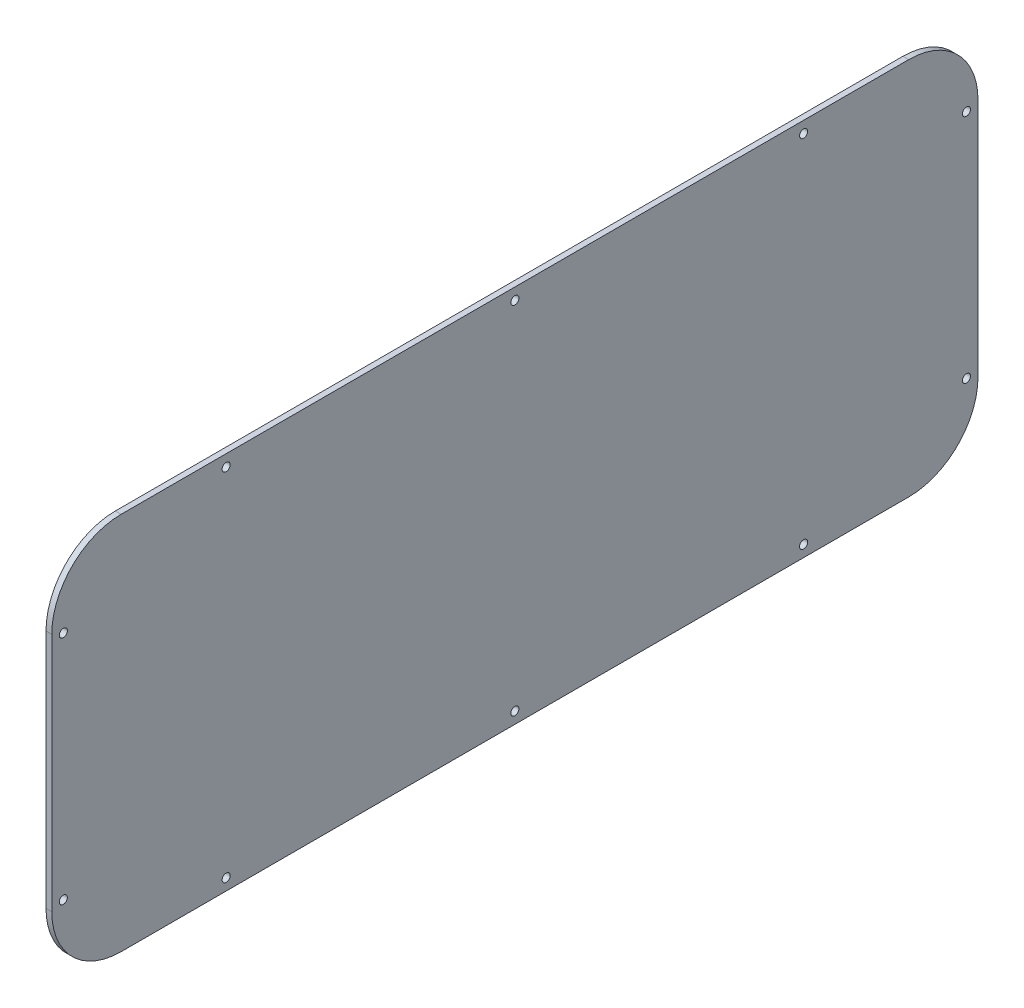
ISO-10303-21;
HEADER;
FILE_DESCRIPTION(('STEP AP214'),'2;1');
FILE_NAME('part.step','',(''),(''),'','','');
FILE_SCHEMA(('AUTOMOTIVE_DESIGN { 1 0 10303 214 1 1 1 1 }'));
ENDSEC;
DATA;
#1=APPLICATION_CONTEXT('core data for automotive mechanical design processes');
#2=APPLICATION_PROTOCOL_DEFINITION('international standard','automotive_design',2000,#1);
#3=PRODUCT_CONTEXT('',#1,'mechanical');
#4=PRODUCT('Part','Part','',(#3));
#5=PRODUCT_RELATED_PRODUCT_CATEGORY('part','',(#4));
#6=PRODUCT_DEFINITION_FORMATION('','',#4);
#7=PRODUCT_DEFINITION_CONTEXT('part definition',#1,'design');
#8=PRODUCT_DEFINITION('design','',#6,#7);
#9=PRODUCT_DEFINITION_SHAPE('','',#8);
#10=(LENGTH_UNIT() NAMED_UNIT(*) SI_UNIT(.MILLI.,.METRE.));
#11=(NAMED_UNIT(*) PLANE_ANGLE_UNIT() SI_UNIT($,.RADIAN.));
#12=(NAMED_UNIT(*) SI_UNIT($,.STERADIAN.) SOLID_ANGLE_UNIT());
#13=UNCERTAINTY_MEASURE_WITH_UNIT(LENGTH_MEASURE(1.E-05),#10,'distance_accuracy_value','');
#14=(GEOMETRIC_REPRESENTATION_CONTEXT(3) GLOBAL_UNCERTAINTY_ASSIGNED_CONTEXT((#13)) GLOBAL_UNIT_ASSIGNED_CONTEXT((#10,
#11,#12)) REPRESENTATION_CONTEXT('',''));
#15=CARTESIAN_POINT('',(0.,0.,0.));
#16=DIRECTION('',(0.,0.,1.));
#17=DIRECTION('',(1.,0.,0.));
#18=AXIS2_PLACEMENT_3D('',#15,#16,#17);
#19=CARTESIAN_POINT('',(-393.5,348.5,1828.5));
#20=DIRECTION('',(1.,0.,0.));
#21=DIRECTION('',(0.,0.,1.));
#22=AXIS2_PLACEMENT_3D('',#19,#20,#21);
#23=PLANE('',#22);
#24=CARTESIAN_POINT('',(-393.5,398.5,1237.5));
#25=DIRECTION('',(-1.,0.,0.));
#26=DIRECTION('',(0.,0.,1.));
#27=AXIS2_PLACEMENT_3D('',#24,#25,#26);
#28=CIRCLE('',#27,3.5);
#29=CARTESIAN_POINT('',(-393.5,398.5,1241.));
#30=VERTEX_POINT('',#29);
#31=EDGE_CURVE('E144',#30,#30,#28,.T.);
#32=ORIENTED_EDGE('',*,*,#31,.T.);
#33=EDGE_LOOP('',(#32));
#34=FACE_BOUND('',#33,.T.);
#35=CARTESIAN_POINT('',(-393.5,144.5,1096.5));
#36=DIRECTION('',(-1.,0.,0.));
#37=DIRECTION('',(0.,0.,1.));
#38=AXIS2_PLACEMENT_3D('',#35,#36,#37);
#39=CIRCLE('',#38,3.49999999999999);
#40=CARTESIAN_POINT('',(-393.5,144.5,1100.));
#41=VERTEX_POINT('',#40);
#42=EDGE_CURVE('E169',#41,#41,#39,.T.);
#43=ORIENTED_EDGE('',*,*,#42,.T.);
#44=EDGE_LOOP('',(#43));
#45=FACE_BOUND('',#44,.T.);
#46=CARTESIAN_POINT('',(-393.5,398.500000000001,1737.5));
#47=DIRECTION('',(-1.,0.,0.));
#48=DIRECTION('',(0.,0.,1.));
#49=AXIS2_PLACEMENT_3D('',#46,#47,#48);
#50=CIRCLE('',#49,3.49999999999998);
#51=CARTESIAN_POINT('',(-393.5,398.500000000001,1741.));
#52=VERTEX_POINT('',#51);
#53=EDGE_CURVE('E177',#52,#52,#50,.T.);
#54=ORIENTED_EDGE('',*,*,#53,.T.);
#55=EDGE_LOOP('',(#54));
#56=FACE_BOUND('',#55,.T.);
#57=CARTESIAN_POINT('',(-393.5,90.4999999999996,1487.5));
#58=DIRECTION('',(-1.,0.,0.));
#59=DIRECTION('',(0.,0.,1.));
#60=AXIS2_PLACEMENT_3D('',#57,#58,#59);
#61=CIRCLE('',#60,3.5);
#62=CARTESIAN_POINT('',(-393.5,90.4999999999996,1491.));
#63=VERTEX_POINT('',#62);
#64=EDGE_CURVE('E185',#63,#63,#61,.T.);
#65=ORIENTED_EDGE('',*,*,#64,.T.);
#66=EDGE_LOOP('',(#65));
#67=FACE_BOUND('',#66,.T.);
#68=CARTESIAN_POINT('',(-393.5,90.4999999999999,1237.5));
#69=DIRECTION('',(-1.,0.,0.));
#70=DIRECTION('',(0.,0.,1.));
#71=AXIS2_PLACEMENT_3D('',#68,#69,#70);
#72=CIRCLE('',#71,3.5);
#73=CARTESIAN_POINT('',(-393.5,90.4999999999999,1241.));
#74=VERTEX_POINT('',#73);
#75=EDGE_CURVE('E118',#74,#74,#72,.T.);
#76=ORIENTED_EDGE('',*,*,#75,.T.);
#77=EDGE_LOOP('',(#76));
#78=FACE_BOUND('',#77,.T.);
#79=CARTESIAN_POINT('',(-393.5,348.5,1828.5));
#80=DIRECTION('',(-1.,0.,0.));
#81=DIRECTION('',(0.,0.,1.));
#82=AXIS2_PLACEMENT_3D('',#79,#80,#81);
#83=CIRCLE('',#82,60.);
#84=CARTESIAN_POINT('',(-393.5,348.5,1888.5));
#85=VERTEX_POINT('',#84);
#86=CARTESIAN_POINT('',(-393.5,408.5,1828.5));
#87=VERTEX_POINT('',#86);
#88=EDGE_CURVE('E135',#85,#87,#83,.T.);
#89=ORIENTED_EDGE('',*,*,#88,.F.);
#90=DIRECTION('',(0.,1.,0.));
#91=VECTOR('',#90,1.);
#92=CARTESIAN_POINT('',(-393.5,140.5,1888.5));
#93=LINE('',#92,#91);
#94=CARTESIAN_POINT('',(-393.5,140.5,1888.5));
#95=VERTEX_POINT('',#94);
#96=EDGE_CURVE('E109',#95,#85,#93,.T.);
#97=ORIENTED_EDGE('',*,*,#96,.F.);
#98=CARTESIAN_POINT('',(-393.5,140.5,1828.5));
#99=DIRECTION('',(-1.,0.,0.));
#100=DIRECTION('',(0.,0.,1.));
#101=AXIS2_PLACEMENT_3D('',#98,#99,#100);
#102=CIRCLE('',#101,60.);
#103=CARTESIAN_POINT('',(-393.5,80.5,1828.5));
#104=VERTEX_POINT('',#103);
#105=EDGE_CURVE('E90',#104,#95,#102,.T.);
#106=ORIENTED_EDGE('',*,*,#105,.F.);
#107=DIRECTION('',(0.,0.,1.));
#108=VECTOR('',#107,1.);
#109=CARTESIAN_POINT('',(-393.5,80.5,1146.5));
#110=LINE('',#109,#108);
#111=CARTESIAN_POINT('',(-393.5,80.5,1146.5));
#112=VERTEX_POINT('',#111);
#113=EDGE_CURVE('E100',#112,#104,#110,.T.);
#114=ORIENTED_EDGE('',*,*,#113,.F.);
#115=CARTESIAN_POINT('',(-393.5,140.5,1146.5));
#116=DIRECTION('',(-1.,0.,0.));
#117=DIRECTION('',(0.,0.,1.));
#118=AXIS2_PLACEMENT_3D('',#115,#116,#117);
#119=CIRCLE('',#118,60.);
#120=CARTESIAN_POINT('',(-393.5,140.5,1086.5));
#121=VERTEX_POINT('',#120);
#122=EDGE_CURVE('E105',#121,#112,#119,.T.);
#123=ORIENTED_EDGE('',*,*,#122,.F.);
#124=DIRECTION('',(0.,-1.,0.));
#125=VECTOR('',#124,1.);
#126=CARTESIAN_POINT('',(-393.5,348.5,1086.5));
#127=LINE('',#126,#125);
#128=CARTESIAN_POINT('',(-393.5,348.5,1086.5));
#129=VERTEX_POINT('',#128);
#130=EDGE_CURVE('E450',#129,#121,#127,.T.);
#131=ORIENTED_EDGE('',*,*,#130,.F.);
#132=CARTESIAN_POINT('',(-393.5,348.5,1146.5));
#133=DIRECTION('',(-1.,0.,0.));
#134=DIRECTION('',(0.,0.,1.));
#135=AXIS2_PLACEMENT_3D('',#132,#133,#134);
#136=CIRCLE('',#135,60.);
#137=CARTESIAN_POINT('',(-393.5,408.5,1146.5));
#138=VERTEX_POINT('',#137);
#139=EDGE_CURVE('E445',#138,#129,#136,.T.);
#140=ORIENTED_EDGE('',*,*,#139,.F.);
#141=DIRECTION('',(0.,0.,-1.));
#142=VECTOR('',#141,1.);
#143=CARTESIAN_POINT('',(-393.5,408.5,1828.5));
#144=LINE('',#143,#142);
#145=EDGE_CURVE('E443',#87,#138,#144,.T.);
#146=ORIENTED_EDGE('',*,*,#145,.F.);
#147=EDGE_LOOP('',(#89,#97,#106,#114,#123,#131,#140,#146));
#148=FACE_BOUND('',#147,.T.);
#149=CARTESIAN_POINT('',(-393.5,90.4999999999992,1737.5));
#150=DIRECTION('',(-1.,0.,0.));
#151=DIRECTION('',(0.,0.,1.));
#152=AXIS2_PLACEMENT_3D('',#149,#150,#151);
#153=CIRCLE('',#152,3.49999999999999);
#154=CARTESIAN_POINT('',(-393.5,90.4999999999992,1741.));
#155=VERTEX_POINT('',#154);
#156=EDGE_CURVE('E178',#155,#155,#153,.T.);
#157=ORIENTED_EDGE('',*,*,#156,.T.);
#158=EDGE_LOOP('',(#157));
#159=FACE_BOUND('',#158,.T.);
#160=CARTESIAN_POINT('',(-393.5,344.500000000001,1878.5));
#161=DIRECTION('',(-1.,0.,0.));
#162=DIRECTION('',(0.,0.,1.));
#163=AXIS2_PLACEMENT_3D('',#160,#161,#162);
#164=CIRCLE('',#163,3.50000000000003);
#165=CARTESIAN_POINT('',(-393.5,344.500000000001,1882.));
#166=VERTEX_POINT('',#165);
#167=EDGE_CURVE('E170',#166,#166,#164,.T.);
#168=ORIENTED_EDGE('',*,*,#167,.T.);
#169=EDGE_LOOP('',(#168));
#170=FACE_BOUND('',#169,.T.);
#171=CARTESIAN_POINT('',(-393.5,144.500000000001,1878.5));
#172=DIRECTION('',(-1.,0.,0.));
#173=DIRECTION('',(0.,0.,1.));
#174=AXIS2_PLACEMENT_3D('',#171,#172,#173);
#175=CIRCLE('',#174,3.49999999999999);
#176=CARTESIAN_POINT('',(-393.5,144.500000000001,1882.));
#177=VERTEX_POINT('',#176);
#178=EDGE_CURVE('E162',#177,#177,#175,.T.);
#179=ORIENTED_EDGE('',*,*,#178,.T.);
#180=EDGE_LOOP('',(#179));
#181=FACE_BOUND('',#180,.T.);
#182=CARTESIAN_POINT('',(-393.5,398.5,1487.5));
#183=DIRECTION('',(-1.,0.,0.));
#184=DIRECTION('',(0.,0.,1.));
#185=AXIS2_PLACEMENT_3D('',#182,#183,#184);
#186=CIRCLE('',#185,3.5);
#187=CARTESIAN_POINT('',(-393.5,398.5,1491.));
#188=VERTEX_POINT('',#187);
#189=EDGE_CURVE('E157',#188,#188,#186,.T.);
#190=ORIENTED_EDGE('',*,*,#189,.T.);
#191=EDGE_LOOP('',(#190));
#192=FACE_BOUND('',#191,.T.);
#193=CARTESIAN_POINT('',(-393.5,344.5,1096.5));
#194=DIRECTION('',(-1.,0.,0.));
#195=DIRECTION('',(0.,0.,1.));
#196=AXIS2_PLACEMENT_3D('',#193,#194,#195);
#197=CIRCLE('',#196,3.5);
#198=CARTESIAN_POINT('',(-393.5,344.5,1100.));
#199=VERTEX_POINT('',#198);
#200=EDGE_CURVE('E151',#199,#199,#197,.T.);
#201=ORIENTED_EDGE('',*,*,#200,.T.);
#202=EDGE_LOOP('',(#201));
#203=FACE_BOUND('',#202,.T.);
#204=ADVANCED_FACE('F15',(#34,#45,#56,#67,#78,#148,#159,#170,#181,#192,#203),#23,.T.);
#205=CARTESIAN_POINT('',(-398.5,348.5,1828.5));
#206=DIRECTION('',(1.,0.,0.));
#207=DIRECTION('',(0.,0.,1.));
#208=AXIS2_PLACEMENT_3D('',#205,#206,#207);
#209=PLANE('',#208);
#210=CARTESIAN_POINT('',(-398.5,348.5,1828.5));
#211=DIRECTION('',(-1.,0.,0.));
#212=DIRECTION('',(0.,0.,1.));
#213=AXIS2_PLACEMENT_3D('',#210,#211,#212);
#214=CIRCLE('',#213,60.);
#215=CARTESIAN_POINT('',(-398.5,348.5,1888.5));
#216=VERTEX_POINT('',#215);
#217=CARTESIAN_POINT('',(-398.5,408.5,1828.5));
#218=VERTEX_POINT('',#217);
#219=EDGE_CURVE('E114',#216,#218,#214,.T.);
#220=ORIENTED_EDGE('',*,*,#219,.T.);
#221=DIRECTION('',(0.,0.,-1.));
#222=VECTOR('',#221,1.);
#223=CARTESIAN_POINT('',(-398.5,408.5,1828.5));
#224=LINE('',#223,#222);
#225=CARTESIAN_POINT('',(-398.5,408.5,1146.5));
#226=VERTEX_POINT('',#225);
#227=EDGE_CURVE('E117',#218,#226,#224,.T.);
#228=ORIENTED_EDGE('',*,*,#227,.T.);
#229=CARTESIAN_POINT('',(-398.5,348.5,1146.5));
#230=DIRECTION('',(-1.,0.,0.));
#231=DIRECTION('',(0.,0.,1.));
#232=AXIS2_PLACEMENT_3D('',#229,#230,#231);
#233=CIRCLE('',#232,60.);
#234=CARTESIAN_POINT('',(-398.5,348.5,1086.5));
#235=VERTEX_POINT('',#234);
#236=EDGE_CURVE('E121',#226,#235,#233,.T.);
#237=ORIENTED_EDGE('',*,*,#236,.T.);
#238=DIRECTION('',(0.,-1.,0.));
#239=VECTOR('',#238,1.);
#240=CARTESIAN_POINT('',(-398.5,348.5,1086.5));
#241=LINE('',#240,#239);
#242=CARTESIAN_POINT('',(-398.5,140.5,1086.5));
#243=VERTEX_POINT('',#242);
#244=EDGE_CURVE('E124',#235,#243,#241,.T.);
#245=ORIENTED_EDGE('',*,*,#244,.T.);
#246=CARTESIAN_POINT('',(-398.5,140.5,1146.5));
#247=DIRECTION('',(-1.,0.,0.));
#248=DIRECTION('',(0.,0.,1.));
#249=AXIS2_PLACEMENT_3D('',#246,#247,#248);
#250=CIRCLE('',#249,60.);
#251=CARTESIAN_POINT('',(-398.5,80.5,1146.5));
#252=VERTEX_POINT('',#251);
#253=EDGE_CURVE('E127',#243,#252,#250,.T.);
#254=ORIENTED_EDGE('',*,*,#253,.T.);
#255=DIRECTION('',(0.,0.,1.));
#256=VECTOR('',#255,1.);
#257=CARTESIAN_POINT('',(-398.5,80.5,1146.5));
#258=LINE('',#257,#256);
#259=CARTESIAN_POINT('',(-398.5,80.5,1828.5));
#260=VERTEX_POINT('',#259);
#261=EDGE_CURVE('E130',#252,#260,#258,.T.);
#262=ORIENTED_EDGE('',*,*,#261,.T.);
#263=CARTESIAN_POINT('',(-398.5,140.5,1828.5));
#264=DIRECTION('',(-1.,0.,0.));
#265=DIRECTION('',(0.,0.,1.));
#266=AXIS2_PLACEMENT_3D('',#263,#264,#265);
#267=CIRCLE('',#266,60.);
#268=CARTESIAN_POINT('',(-398.5,140.5,1888.5));
#269=VERTEX_POINT('',#268);
#270=EDGE_CURVE('E93',#260,#269,#267,.T.);
#271=ORIENTED_EDGE('',*,*,#270,.T.);
#272=DIRECTION('',(0.,1.,0.));
#273=VECTOR('',#272,1.);
#274=CARTESIAN_POINT('',(-398.5,140.5,1888.5));
#275=LINE('',#274,#273);
#276=EDGE_CURVE('E133',#269,#216,#275,.T.);
#277=ORIENTED_EDGE('',*,*,#276,.T.);
#278=EDGE_LOOP('',(#220,#228,#237,#245,#254,#262,#271,#277));
#279=FACE_BOUND('',#278,.T.);
#280=CARTESIAN_POINT('',(-398.5,90.4999999999999,1237.5));
#281=DIRECTION('',(-1.,0.,0.));
#282=DIRECTION('',(0.,0.,1.));
#283=AXIS2_PLACEMENT_3D('',#280,#281,#282);
#284=CIRCLE('',#283,3.5);
#285=CARTESIAN_POINT('',(-398.5,90.4999999999999,1241.));
#286=VERTEX_POINT('',#285);
#287=EDGE_CURVE('E181',#286,#286,#284,.T.);
#288=ORIENTED_EDGE('',*,*,#287,.F.);
#289=EDGE_LOOP('',(#288));
#290=FACE_BOUND('',#289,.T.);
#291=CARTESIAN_POINT('',(-398.5,90.4999999999992,1737.5));
#292=DIRECTION('',(-1.,0.,0.));
#293=DIRECTION('',(0.,0.,1.));
#294=AXIS2_PLACEMENT_3D('',#291,#292,#293);
#295=CIRCLE('',#294,3.49999999999999);
#296=CARTESIAN_POINT('',(-398.5,90.4999999999992,1741.));
#297=VERTEX_POINT('',#296);
#298=EDGE_CURVE('E182',#297,#297,#295,.T.);
#299=ORIENTED_EDGE('',*,*,#298,.F.);
#300=EDGE_LOOP('',(#299));
#301=FACE_BOUND('',#300,.T.);
#302=CARTESIAN_POINT('',(-398.5,90.4999999999996,1487.5));
#303=DIRECTION('',(-1.,0.,0.));
#304=DIRECTION('',(0.,0.,1.));
#305=AXIS2_PLACEMENT_3D('',#302,#303,#304);
#306=CIRCLE('',#305,3.5);
#307=CARTESIAN_POINT('',(-398.5,90.4999999999996,1491.));
#308=VERTEX_POINT('',#307);
#309=EDGE_CURVE('E173',#308,#308,#306,.T.);
#310=ORIENTED_EDGE('',*,*,#309,.F.);
#311=EDGE_LOOP('',(#310));
#312=FACE_BOUND('',#311,.T.);
#313=CARTESIAN_POINT('',(-398.5,344.500000000001,1878.5));
#314=DIRECTION('',(-1.,0.,0.));
#315=DIRECTION('',(0.,0.,1.));
#316=AXIS2_PLACEMENT_3D('',#313,#314,#315);
#317=CIRCLE('',#316,3.50000000000003);
#318=CARTESIAN_POINT('',(-398.5,344.500000000001,1882.));
#319=VERTEX_POINT('',#318);
#320=EDGE_CURVE('E174',#319,#319,#317,.T.);
#321=ORIENTED_EDGE('',*,*,#320,.F.);
#322=EDGE_LOOP('',(#321));
#323=FACE_BOUND('',#322,.T.);
#324=CARTESIAN_POINT('',(-398.5,398.500000000001,1737.5));
#325=DIRECTION('',(-1.,0.,0.));
#326=DIRECTION('',(0.,0.,1.));
#327=AXIS2_PLACEMENT_3D('',#324,#325,#326);
#328=CIRCLE('',#327,3.49999999999998);
#329=CARTESIAN_POINT('',(-398.5,398.500000000001,1741.));
#330=VERTEX_POINT('',#329);
#331=EDGE_CURVE('E165',#330,#330,#328,.T.);
#332=ORIENTED_EDGE('',*,*,#331,.F.);
#333=EDGE_LOOP('',(#332));
#334=FACE_BOUND('',#333,.T.);
#335=CARTESIAN_POINT('',(-398.5,144.500000000001,1878.5));
#336=DIRECTION('',(-1.,0.,0.));
#337=DIRECTION('',(0.,0.,1.));
#338=AXIS2_PLACEMENT_3D('',#335,#336,#337);
#339=CIRCLE('',#338,3.49999999999999);
#340=CARTESIAN_POINT('',(-398.5,144.500000000001,1882.));
#341=VERTEX_POINT('',#340);
#342=EDGE_CURVE('E166',#341,#341,#339,.T.);
#343=ORIENTED_EDGE('',*,*,#342,.F.);
#344=EDGE_LOOP('',(#343));
#345=FACE_BOUND('',#344,.T.);
#346=CARTESIAN_POINT('',(-398.5,144.5,1096.5));
#347=DIRECTION('',(-1.,0.,0.));
#348=DIRECTION('',(0.,0.,1.));
#349=AXIS2_PLACEMENT_3D('',#346,#347,#348);
#350=CIRCLE('',#349,3.49999999999999);
#351=CARTESIAN_POINT('',(-398.5,144.5,1100.));
#352=VERTEX_POINT('',#351);
#353=EDGE_CURVE('E19',#352,#352,#350,.T.);
#354=ORIENTED_EDGE('',*,*,#353,.F.);
#355=EDGE_LOOP('',(#354));
#356=FACE_BOUND('',#355,.T.);
#357=CARTESIAN_POINT('',(-398.5,398.5,1487.5));
#358=DIRECTION('',(-1.,0.,0.));
#359=DIRECTION('',(0.,0.,1.));
#360=AXIS2_PLACEMENT_3D('',#357,#358,#359);
#361=CIRCLE('',#360,3.5);
#362=CARTESIAN_POINT('',(-398.5,398.5,1491.));
#363=VERTEX_POINT('',#362);
#364=EDGE_CURVE('E147',#363,#363,#361,.T.);
#365=ORIENTED_EDGE('',*,*,#364,.F.);
#366=EDGE_LOOP('',(#365));
#367=FACE_BOUND('',#366,.T.);
#368=CARTESIAN_POINT('',(-398.5,398.5,1237.5));
#369=DIRECTION('',(-1.,0.,0.));
#370=DIRECTION('',(0.,0.,1.));
#371=AXIS2_PLACEMENT_3D('',#368,#369,#370);
#372=CIRCLE('',#371,3.5);
#373=CARTESIAN_POINT('',(-398.5,398.5,1241.));
#374=VERTEX_POINT('',#373);
#375=EDGE_CURVE('E148',#374,#374,#372,.T.);
#376=ORIENTED_EDGE('',*,*,#375,.F.);
#377=EDGE_LOOP('',(#376));
#378=FACE_BOUND('',#377,.T.);
#379=CARTESIAN_POINT('',(-398.5,344.5,1096.5));
#380=DIRECTION('',(-1.,0.,0.));
#381=DIRECTION('',(0.,0.,1.));
#382=AXIS2_PLACEMENT_3D('',#379,#380,#381);
#383=CIRCLE('',#382,3.5);
#384=CARTESIAN_POINT('',(-398.5,344.5,1100.));
#385=VERTEX_POINT('',#384);
#386=EDGE_CURVE('E154',#385,#385,#383,.T.);
#387=ORIENTED_EDGE('',*,*,#386,.F.);
#388=EDGE_LOOP('',(#387));
#389=FACE_BOUND('',#388,.T.);
#390=ADVANCED_FACE('F205',(#279,#290,#301,#312,#323,#334,#345,#356,#367,#378,#389),#209,.F.);
#391=CARTESIAN_POINT('',(-393.5,348.5,1828.5));
#392=DIRECTION('',(-1.,0.,0.));
#393=DIRECTION('',(0.,0.,-1.));
#394=AXIS2_PLACEMENT_3D('',#391,#392,#393);
#395=CYLINDRICAL_SURFACE('',#394,60.);
#396=ORIENTED_EDGE('',*,*,#219,.F.);
#397=DIRECTION('',(-1.,0.,0.));
#398=VECTOR('',#397,1.);
#399=CARTESIAN_POINT('',(-393.5,348.5,1888.5));
#400=LINE('',#399,#398);
#401=EDGE_CURVE('E34',#85,#216,#400,.T.);
#402=ORIENTED_EDGE('',*,*,#401,.F.);
#403=ORIENTED_EDGE('',*,*,#88,.T.);
#404=DIRECTION('',(-1.,0.,0.));
#405=VECTOR('',#404,1.);
#406=CARTESIAN_POINT('',(-393.5,408.5,1828.5));
#407=LINE('',#406,#405);
#408=EDGE_CURVE('E10',#87,#218,#407,.T.);
#409=ORIENTED_EDGE('',*,*,#408,.T.);
#410=EDGE_LOOP('',(#396,#402,#403,#409));
#411=FACE_BOUND('',#410,.T.);
#412=ADVANCED_FACE('F208',(#411),#395,.T.);
#413=CARTESIAN_POINT('',(-393.5,408.5,1828.5));
#414=DIRECTION('',(0.,-1.,0.));
#415=DIRECTION('',(0.,0.,1.));
#416=AXIS2_PLACEMENT_3D('',#413,#414,#415);
#417=PLANE('',#416);
#418=ORIENTED_EDGE('',*,*,#227,.F.);
#419=ORIENTED_EDGE('',*,*,#408,.F.);
#420=ORIENTED_EDGE('',*,*,#145,.T.);
#421=DIRECTION('',(-1.,0.,0.));
#422=VECTOR('',#421,1.);
#423=CARTESIAN_POINT('',(-393.5,408.5,1146.5));
#424=LINE('',#423,#422);
#425=EDGE_CURVE('E25',#138,#226,#424,.T.);
#426=ORIENTED_EDGE('',*,*,#425,.T.);
#427=EDGE_LOOP('',(#418,#419,#420,#426));
#428=FACE_BOUND('',#427,.T.);
#429=ADVANCED_FACE('F253',(#428),#417,.F.);
#430=CARTESIAN_POINT('',(-393.5,348.5,1146.5));
#431=DIRECTION('',(-1.,0.,0.));
#432=DIRECTION('',(0.,0.,-1.));
#433=AXIS2_PLACEMENT_3D('',#430,#431,#432);
#434=CYLINDRICAL_SURFACE('',#433,60.);
#435=ORIENTED_EDGE('',*,*,#236,.F.);
#436=ORIENTED_EDGE('',*,*,#425,.F.);
#437=ORIENTED_EDGE('',*,*,#139,.T.);
#438=DIRECTION('',(-1.,0.,0.));
#439=VECTOR('',#438,1.);
#440=CARTESIAN_POINT('',(-393.5,348.5,1086.5));
#441=LINE('',#440,#439);
#442=EDGE_CURVE('E141',#129,#235,#441,.T.);
#443=ORIENTED_EDGE('',*,*,#442,.T.);
#444=EDGE_LOOP('',(#435,#436,#437,#443));
#445=FACE_BOUND('',#444,.T.);
#446=ADVANCED_FACE('F249',(#445),#434,.T.);
#447=CARTESIAN_POINT('',(-393.5,348.5,1086.5));
#448=DIRECTION('',(0.,0.,1.));
#449=DIRECTION('',(-1.,0.,0.));
#450=AXIS2_PLACEMENT_3D('',#447,#448,#449);
#451=PLANE('',#450);
#452=ORIENTED_EDGE('',*,*,#244,.F.);
#453=ORIENTED_EDGE('',*,*,#442,.F.);
#454=ORIENTED_EDGE('',*,*,#130,.T.);
#455=DIRECTION('',(-1.,0.,0.));
#456=VECTOR('',#455,1.);
#457=CARTESIAN_POINT('',(-393.5,140.5,1086.5));
#458=LINE('',#457,#456);
#459=EDGE_CURVE('E139',#121,#243,#458,.T.);
#460=ORIENTED_EDGE('',*,*,#459,.T.);
#461=EDGE_LOOP('',(#452,#453,#454,#460));
#462=FACE_BOUND('',#461,.T.);
#463=ADVANCED_FACE('F245',(#462),#451,.F.);
#464=CARTESIAN_POINT('',(-393.5,140.5,1146.5));
#465=DIRECTION('',(-1.,0.,0.));
#466=DIRECTION('',(0.,0.,-1.));
#467=AXIS2_PLACEMENT_3D('',#464,#465,#466);
#468=CYLINDRICAL_SURFACE('',#467,60.);
#469=ORIENTED_EDGE('',*,*,#253,.F.);
#470=ORIENTED_EDGE('',*,*,#459,.F.);
#471=ORIENTED_EDGE('',*,*,#122,.T.);
#472=DIRECTION('',(-1.,0.,0.));
#473=VECTOR('',#472,1.);
#474=CARTESIAN_POINT('',(-393.5,80.5,1146.5));
#475=LINE('',#474,#473);
#476=EDGE_CURVE('E97',#112,#252,#475,.T.);
#477=ORIENTED_EDGE('',*,*,#476,.T.);
#478=EDGE_LOOP('',(#469,#470,#471,#477));
#479=FACE_BOUND('',#478,.T.);
#480=ADVANCED_FACE('F242',(#479),#468,.T.);
#481=CARTESIAN_POINT('',(-393.5,80.5,1146.5));
#482=DIRECTION('',(0.,1.,0.));
#483=DIRECTION('',(0.,0.,-1.));
#484=AXIS2_PLACEMENT_3D('',#481,#482,#483);
#485=PLANE('',#484);
#486=ORIENTED_EDGE('',*,*,#261,.F.);
#487=ORIENTED_EDGE('',*,*,#476,.F.);
#488=ORIENTED_EDGE('',*,*,#113,.T.);
#489=DIRECTION('',(-1.,0.,0.));
#490=VECTOR('',#489,1.);
#491=CARTESIAN_POINT('',(-393.5,80.5,1828.5));
#492=LINE('',#491,#490);
#493=EDGE_CURVE('E86',#104,#260,#492,.T.);
#494=ORIENTED_EDGE('',*,*,#493,.T.);
#495=EDGE_LOOP('',(#486,#487,#488,#494));
#496=FACE_BOUND('',#495,.T.);
#497=ADVANCED_FACE('F101',(#496),#485,.F.);
#498=CARTESIAN_POINT('',(-393.5,140.5,1828.5));
#499=DIRECTION('',(-1.,0.,0.));
#500=DIRECTION('',(0.,0.,-1.));
#501=AXIS2_PLACEMENT_3D('',#498,#499,#500);
#502=CYLINDRICAL_SURFACE('',#501,60.);
#503=ORIENTED_EDGE('',*,*,#270,.F.);
#504=ORIENTED_EDGE('',*,*,#493,.F.);
#505=ORIENTED_EDGE('',*,*,#105,.T.);
#506=DIRECTION('',(-1.,0.,0.));
#507=VECTOR('',#506,1.);
#508=CARTESIAN_POINT('',(-393.5,140.5,1888.5));
#509=LINE('',#508,#507);
#510=EDGE_CURVE('E62',#95,#269,#509,.T.);
#511=ORIENTED_EDGE('',*,*,#510,.T.);
#512=EDGE_LOOP('',(#503,#504,#505,#511));
#513=FACE_BOUND('',#512,.T.);
#514=ADVANCED_FACE('F88',(#513),#502,.T.);
#515=CARTESIAN_POINT('',(-393.5,140.5,1888.5));
#516=DIRECTION('',(0.,0.,-1.));
#517=DIRECTION('',(1.,0.,0.));
#518=AXIS2_PLACEMENT_3D('',#515,#516,#517);
#519=PLANE('',#518);
#520=ORIENTED_EDGE('',*,*,#276,.F.);
#521=ORIENTED_EDGE('',*,*,#510,.F.);
#522=ORIENTED_EDGE('',*,*,#96,.T.);
#523=ORIENTED_EDGE('',*,*,#401,.T.);
#524=EDGE_LOOP('',(#520,#521,#522,#523));
#525=FACE_BOUND('',#524,.T.);
#526=ADVANCED_FACE('F234',(#525),#519,.F.);
#527=CARTESIAN_POINT('',(-393.5,90.4999999999999,1237.5));
#528=DIRECTION('',(-1.,0.,0.));
#529=DIRECTION('',(0.,0.,-1.));
#530=AXIS2_PLACEMENT_3D('',#527,#528,#529);
#531=CYLINDRICAL_SURFACE('',#530,3.5);
#532=ORIENTED_EDGE('',*,*,#75,.F.);
#533=EDGE_LOOP('',(#532));
#534=FACE_BOUND('',#533,.T.);
#535=ORIENTED_EDGE('',*,*,#287,.T.);
#536=EDGE_LOOP('',(#535));
#537=FACE_BOUND('',#536,.T.);
#538=ADVANCED_FACE('F237',(#534,#537),#531,.F.);
#539=CARTESIAN_POINT('',(-393.5,90.4999999999992,1737.5));
#540=DIRECTION('',(-1.,0.,0.));
#541=DIRECTION('',(0.,0.,-1.));
#542=AXIS2_PLACEMENT_3D('',#539,#540,#541);
#543=CYLINDRICAL_SURFACE('',#542,3.49999999999999);
#544=ORIENTED_EDGE('',*,*,#156,.F.);
#545=EDGE_LOOP('',(#544));
#546=FACE_BOUND('',#545,.T.);
#547=ORIENTED_EDGE('',*,*,#298,.T.);
#548=EDGE_LOOP('',(#547));
#549=FACE_BOUND('',#548,.T.);
#550=ADVANCED_FACE('F271',(#546,#549),#543,.F.);
#551=CARTESIAN_POINT('',(-393.5,90.4999999999996,1487.5));
#552=DIRECTION('',(-1.,0.,0.));
#553=DIRECTION('',(0.,0.,-1.));
#554=AXIS2_PLACEMENT_3D('',#551,#552,#553);
#555=CYLINDRICAL_SURFACE('',#554,3.5);
#556=ORIENTED_EDGE('',*,*,#64,.F.);
#557=EDGE_LOOP('',(#556));
#558=FACE_BOUND('',#557,.T.);
#559=ORIENTED_EDGE('',*,*,#309,.T.);
#560=EDGE_LOOP('',(#559));
#561=FACE_BOUND('',#560,.T.);
#562=ADVANCED_FACE('F268',(#558,#561),#555,.F.);
#563=CARTESIAN_POINT('',(-393.5,344.500000000001,1878.5));
#564=DIRECTION('',(-1.,0.,0.));
#565=DIRECTION('',(0.,0.,-1.));
#566=AXIS2_PLACEMENT_3D('',#563,#564,#565);
#567=CYLINDRICAL_SURFACE('',#566,3.50000000000003);
#568=ORIENTED_EDGE('',*,*,#167,.F.);
#569=EDGE_LOOP('',(#568));
#570=FACE_BOUND('',#569,.T.);
#571=ORIENTED_EDGE('',*,*,#320,.T.);
#572=EDGE_LOOP('',(#571));
#573=FACE_BOUND('',#572,.T.);
#574=ADVANCED_FACE('F266',(#570,#573),#567,.F.);
#575=CARTESIAN_POINT('',(-393.5,398.500000000001,1737.5));
#576=DIRECTION('',(-1.,0.,0.));
#577=DIRECTION('',(0.,0.,-1.));
#578=AXIS2_PLACEMENT_3D('',#575,#576,#577);
#579=CYLINDRICAL_SURFACE('',#578,3.49999999999998);
#580=ORIENTED_EDGE('',*,*,#53,.F.);
#581=EDGE_LOOP('',(#580));
#582=FACE_BOUND('',#581,.T.);
#583=ORIENTED_EDGE('',*,*,#331,.T.);
#584=EDGE_LOOP('',(#583));
#585=FACE_BOUND('',#584,.T.);
#586=ADVANCED_FACE('F263',(#582,#585),#579,.F.);
#587=CARTESIAN_POINT('',(-393.5,144.500000000001,1878.5));
#588=DIRECTION('',(-1.,0.,0.));
#589=DIRECTION('',(0.,0.,-1.));
#590=AXIS2_PLACEMENT_3D('',#587,#588,#589);
#591=CYLINDRICAL_SURFACE('',#590,3.49999999999999);
#592=ORIENTED_EDGE('',*,*,#178,.F.);
#593=EDGE_LOOP('',(#592));
#594=FACE_BOUND('',#593,.T.);
#595=ORIENTED_EDGE('',*,*,#342,.T.);
#596=EDGE_LOOP('',(#595));
#597=FACE_BOUND('',#596,.T.);
#598=ADVANCED_FACE('F261',(#594,#597),#591,.F.);
#599=CARTESIAN_POINT('',(-393.5,144.5,1096.5));
#600=DIRECTION('',(-1.,0.,0.));
#601=DIRECTION('',(0.,0.,-1.));
#602=AXIS2_PLACEMENT_3D('',#599,#600,#601);
#603=CYLINDRICAL_SURFACE('',#602,3.49999999999999);
#604=ORIENTED_EDGE('',*,*,#42,.F.);
#605=EDGE_LOOP('',(#604));
#606=FACE_BOUND('',#605,.T.);
#607=ORIENTED_EDGE('',*,*,#353,.T.);
#608=EDGE_LOOP('',(#607));
#609=FACE_BOUND('',#608,.T.);
#610=ADVANCED_FACE('F203',(#606,#609),#603,.F.);
#611=CARTESIAN_POINT('',(-393.5,398.5,1487.5));
#612=DIRECTION('',(-1.,0.,0.));
#613=DIRECTION('',(0.,0.,-1.));
#614=AXIS2_PLACEMENT_3D('',#611,#612,#613);
#615=CYLINDRICAL_SURFACE('',#614,3.5);
#616=ORIENTED_EDGE('',*,*,#189,.F.);
#617=EDGE_LOOP('',(#616));
#618=FACE_BOUND('',#617,.T.);
#619=ORIENTED_EDGE('',*,*,#364,.T.);
#620=EDGE_LOOP('',(#619));
#621=FACE_BOUND('',#620,.T.);
#622=ADVANCED_FACE('F224',(#618,#621),#615,.F.);
#623=CARTESIAN_POINT('',(-393.5,398.5,1237.5));
#624=DIRECTION('',(-1.,0.,0.));
#625=DIRECTION('',(0.,0.,-1.));
#626=AXIS2_PLACEMENT_3D('',#623,#624,#625);
#627=CYLINDRICAL_SURFACE('',#626,3.5);
#628=ORIENTED_EDGE('',*,*,#31,.F.);
#629=EDGE_LOOP('',(#628));
#630=FACE_BOUND('',#629,.T.);
#631=ORIENTED_EDGE('',*,*,#375,.T.);
#632=EDGE_LOOP('',(#631));
#633=FACE_BOUND('',#632,.T.);
#634=ADVANCED_FACE('F218',(#630,#633),#627,.F.);
#635=CARTESIAN_POINT('',(-393.5,344.5,1096.5));
#636=DIRECTION('',(-1.,0.,0.));
#637=DIRECTION('',(0.,0.,-1.));
#638=AXIS2_PLACEMENT_3D('',#635,#636,#637);
#639=CYLINDRICAL_SURFACE('',#638,3.5);
#640=ORIENTED_EDGE('',*,*,#200,.F.);
#641=EDGE_LOOP('',(#640));
#642=FACE_BOUND('',#641,.T.);
#643=ORIENTED_EDGE('',*,*,#386,.T.);
#644=EDGE_LOOP('',(#643));
#645=FACE_BOUND('',#644,.T.);
#646=ADVANCED_FACE('F17',(#642,#645),#639,.F.);
#647=CLOSED_SHELL('',(#204,#390,#412,#429,#446,#463,#480,#497,#514,#526,#538,#550,#562,#574,
#586,#598,#610,#622,#634,#646));
#648=MANIFOLD_SOLID_BREP('B1',#647);
#649=ADVANCED_BREP_SHAPE_REPRESENTATION('',(#18,#648),#14);
#650=SHAPE_DEFINITION_REPRESENTATION(#9,#649);
ENDSEC;
END-ISO-10303-21;
